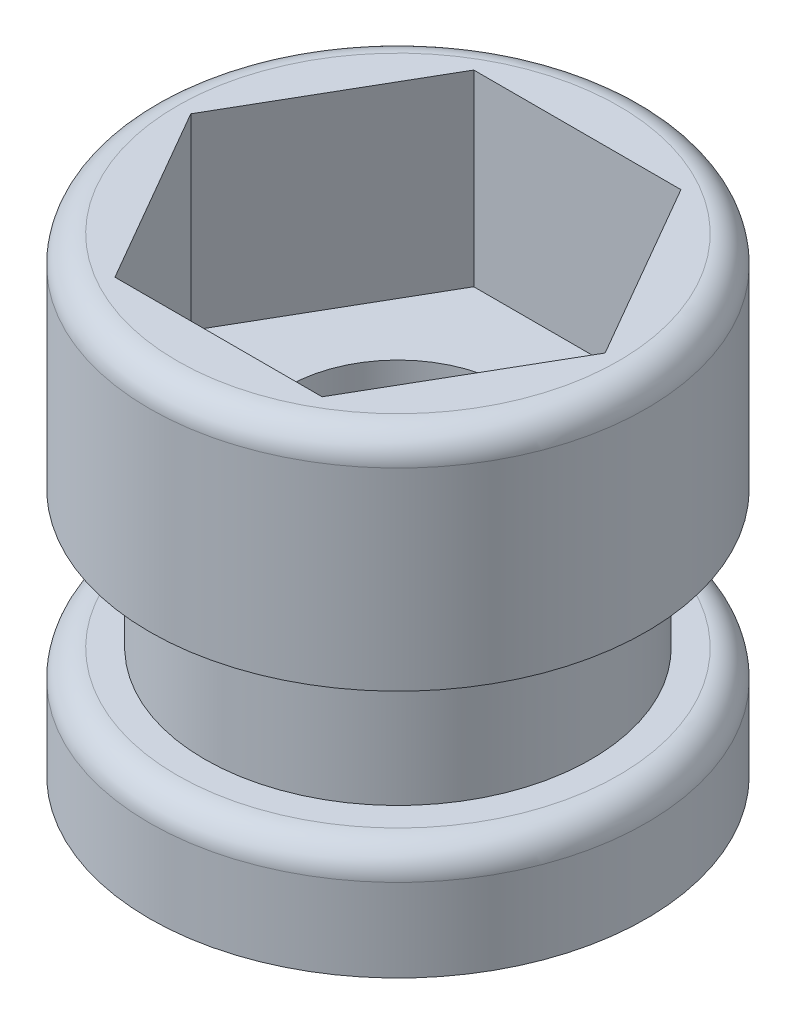
ISO-10303-21;
HEADER;
FILE_DESCRIPTION(('STEP AP214'),'2;1');
FILE_NAME('part.step','',(''),(''),'','','');
FILE_SCHEMA(('AUTOMOTIVE_DESIGN { 1 0 10303 214 1 1 1 1 }'));
ENDSEC;
DATA;
#1=APPLICATION_CONTEXT('core data for automotive mechanical design processes');
#2=APPLICATION_PROTOCOL_DEFINITION('international standard','automotive_design',2000,#1);
#3=PRODUCT_CONTEXT('',#1,'mechanical');
#4=PRODUCT('Part','Part','',(#3));
#5=PRODUCT_RELATED_PRODUCT_CATEGORY('part','',(#4));
#6=PRODUCT_DEFINITION_FORMATION('','',#4);
#7=PRODUCT_DEFINITION_CONTEXT('part definition',#1,'design');
#8=PRODUCT_DEFINITION('design','',#6,#7);
#9=PRODUCT_DEFINITION_SHAPE('','',#8);
#10=(LENGTH_UNIT() NAMED_UNIT(*) SI_UNIT(.MILLI.,.METRE.));
#11=(NAMED_UNIT(*) PLANE_ANGLE_UNIT() SI_UNIT($,.RADIAN.));
#12=(NAMED_UNIT(*) SI_UNIT($,.STERADIAN.) SOLID_ANGLE_UNIT());
#13=UNCERTAINTY_MEASURE_WITH_UNIT(LENGTH_MEASURE(1.E-05),#10,'distance_accuracy_value','');
#14=(GEOMETRIC_REPRESENTATION_CONTEXT(3) GLOBAL_UNCERTAINTY_ASSIGNED_CONTEXT((#13)) GLOBAL_UNIT_ASSIGNED_CONTEXT((#10,
#11,#12)) REPRESENTATION_CONTEXT('',''));
#15=CARTESIAN_POINT('',(0.,0.,0.));
#16=DIRECTION('',(0.,0.,1.));
#17=DIRECTION('',(1.,0.,0.));
#18=AXIS2_PLACEMENT_3D('',#15,#16,#17);
#19=CARTESIAN_POINT('',(0.,18.,0.));
#20=DIRECTION('',(0.,-1.,0.));
#21=DIRECTION('',(0.,0.,-1.));
#22=AXIS2_PLACEMENT_3D('',#19,#20,#21);
#23=CYLINDRICAL_SURFACE('',#22,4.);
#24=CARTESIAN_POINT('',(0.,0.,0.));
#25=DIRECTION('',(0.,-1.,0.));
#26=DIRECTION('',(0.,0.,-1.));
#27=AXIS2_PLACEMENT_3D('',#24,#25,#26);
#28=CIRCLE('',#27,4.);
#29=CARTESIAN_POINT('',(0.,0.,-4.));
#30=VERTEX_POINT('',#29);
#31=EDGE_CURVE('E141',#30,#30,#28,.T.);
#32=ORIENTED_EDGE('',*,*,#31,.T.);
#33=EDGE_LOOP('',(#32));
#34=FACE_BOUND('',#33,.T.);
#35=CARTESIAN_POINT('',(0.,10.2,0.));
#36=DIRECTION('',(0.,1.,0.));
#37=DIRECTION('',(0.,0.,1.));
#38=AXIS2_PLACEMENT_3D('',#35,#36,#37);
#39=CIRCLE('',#38,4.);
#40=CARTESIAN_POINT('',(0.,10.2,4.));
#41=VERTEX_POINT('',#40);
#42=EDGE_CURVE('E36',#41,#41,#39,.F.);
#43=ORIENTED_EDGE('',*,*,#42,.F.);
#44=EDGE_LOOP('',(#43));
#45=FACE_BOUND('',#44,.T.);
#46=ADVANCED_FACE('F32',(#34,#45),#23,.F.);
#47=CARTESIAN_POINT('',(0.,4.,0.));
#48=DIRECTION('',(0.,-1.,0.));
#49=DIRECTION('',(0.,0.,-1.));
#50=AXIS2_PLACEMENT_3D('',#47,#48,#49);
#51=CYLINDRICAL_SURFACE('',#50,9.);
#52=CARTESIAN_POINT('',(0.,3.,0.));
#53=DIRECTION('',(0.,1.,0.));
#54=DIRECTION('',(0.,0.,1.));
#55=AXIS2_PLACEMENT_3D('',#52,#53,#54);
#56=CIRCLE('',#55,9.);
#57=CARTESIAN_POINT('',(0.,3.,9.));
#58=VERTEX_POINT('',#57);
#59=EDGE_CURVE('E11',#58,#58,#56,.F.);
#60=ORIENTED_EDGE('',*,*,#59,.T.);
#61=EDGE_LOOP('',(#60));
#62=FACE_BOUND('',#61,.T.);
#63=CARTESIAN_POINT('',(0.,0.,0.));
#64=DIRECTION('',(0.,1.,0.));
#65=DIRECTION('',(0.,0.,1.));
#66=AXIS2_PLACEMENT_3D('',#63,#64,#65);
#67=CIRCLE('',#66,9.);
#68=CARTESIAN_POINT('',(0.,0.,9.));
#69=VERTEX_POINT('',#68);
#70=EDGE_CURVE('E151',#69,#69,#67,.T.);
#71=ORIENTED_EDGE('',*,*,#70,.T.);
#72=EDGE_LOOP('',(#71));
#73=FACE_BOUND('',#72,.T.);
#74=ADVANCED_FACE('F181',(#62,#73),#51,.T.);
#75=CARTESIAN_POINT('',(0.,4.,0.));
#76=DIRECTION('',(0.,1.,0.));
#77=DIRECTION('',(0.,0.,1.));
#78=AXIS2_PLACEMENT_3D('',#75,#76,#77);
#79=PLANE('',#78);
#80=CARTESIAN_POINT('',(0.,4.,0.));
#81=DIRECTION('',(0.,1.,0.));
#82=DIRECTION('',(0.,0.,1.));
#83=AXIS2_PLACEMENT_3D('',#80,#81,#82);
#84=CIRCLE('',#83,8.);
#85=CARTESIAN_POINT('',(0.,4.,8.));
#86=VERTEX_POINT('',#85);
#87=EDGE_CURVE('E41',#86,#86,#84,.T.);
#88=ORIENTED_EDGE('',*,*,#87,.T.);
#89=EDGE_LOOP('',(#88));
#90=FACE_BOUND('',#89,.T.);
#91=CARTESIAN_POINT('',(0.,4.,0.));
#92=DIRECTION('',(0.,1.,0.));
#93=DIRECTION('',(0.,0.,1.));
#94=AXIS2_PLACEMENT_3D('',#91,#92,#93);
#95=CIRCLE('',#94,7.);
#96=CARTESIAN_POINT('',(0.,4.,7.));
#97=VERTEX_POINT('',#96);
#98=EDGE_CURVE('E147',#97,#97,#95,.T.);
#99=ORIENTED_EDGE('',*,*,#98,.F.);
#100=EDGE_LOOP('',(#99));
#101=FACE_BOUND('',#100,.T.);
#102=ADVANCED_FACE('F165',(#90,#101),#79,.T.);
#103=CARTESIAN_POINT('',(0.,0.,0.));
#104=DIRECTION('',(0.,1.,0.));
#105=DIRECTION('',(0.,0.,1.));
#106=AXIS2_PLACEMENT_3D('',#103,#104,#105);
#107=PLANE('',#106);
#108=ORIENTED_EDGE('',*,*,#31,.F.);
#109=EDGE_LOOP('',(#108));
#110=FACE_BOUND('',#109,.T.);
#111=ORIENTED_EDGE('',*,*,#70,.F.);
#112=EDGE_LOOP('',(#111));
#113=FACE_BOUND('',#112,.T.);
#114=ADVANCED_FACE('F207',(#110,#113),#107,.F.);
#115=CARTESIAN_POINT('',(0.,9.,0.));
#116=DIRECTION('',(0.,-1.,0.));
#117=DIRECTION('',(0.,0.,-1.));
#118=AXIS2_PLACEMENT_3D('',#115,#116,#117);
#119=CYLINDRICAL_SURFACE('',#118,7.);
#120=CARTESIAN_POINT('',(0.,9.,0.));
#121=DIRECTION('',(0.,1.,0.));
#122=DIRECTION('',(0.,0.,1.));
#123=AXIS2_PLACEMENT_3D('',#120,#121,#122);
#124=CIRCLE('',#123,7.);
#125=CARTESIAN_POINT('',(0.,9.,7.));
#126=VERTEX_POINT('',#125);
#127=EDGE_CURVE('E148',#126,#126,#124,.T.);
#128=ORIENTED_EDGE('',*,*,#127,.F.);
#129=EDGE_LOOP('',(#128));
#130=FACE_BOUND('',#129,.T.);
#131=ORIENTED_EDGE('',*,*,#98,.T.);
#132=EDGE_LOOP('',(#131));
#133=FACE_BOUND('',#132,.T.);
#134=ADVANCED_FACE('F203',(#130,#133),#119,.T.);
#135=CARTESIAN_POINT('',(0.,17.,0.));
#136=DIRECTION('',(0.,-1.,0.));
#137=DIRECTION('',(0.,0.,-1.));
#138=AXIS2_PLACEMENT_3D('',#135,#136,#137);
#139=CYLINDRICAL_SURFACE('',#138,9.);
#140=CARTESIAN_POINT('',(0.,16.,0.));
#141=DIRECTION('',(0.,1.,0.));
#142=DIRECTION('',(0.,0.,1.));
#143=AXIS2_PLACEMENT_3D('',#140,#141,#142);
#144=CIRCLE('',#143,9.);
#145=CARTESIAN_POINT('',(0.,16.,9.));
#146=VERTEX_POINT('',#145);
#147=EDGE_CURVE('E159',#146,#146,#144,.F.);
#148=ORIENTED_EDGE('',*,*,#147,.T.);
#149=EDGE_LOOP('',(#148));
#150=FACE_BOUND('',#149,.T.);
#151=CARTESIAN_POINT('',(0.,9.,0.));
#152=DIRECTION('',(0.,1.,0.));
#153=DIRECTION('',(0.,0.,1.));
#154=AXIS2_PLACEMENT_3D('',#151,#152,#153);
#155=CIRCLE('',#154,9.);
#156=CARTESIAN_POINT('',(0.,9.,9.));
#157=VERTEX_POINT('',#156);
#158=EDGE_CURVE('E144',#157,#157,#155,.T.);
#159=ORIENTED_EDGE('',*,*,#158,.T.);
#160=EDGE_LOOP('',(#159));
#161=FACE_BOUND('',#160,.T.);
#162=ADVANCED_FACE('F196',(#150,#161),#139,.T.);
#163=CARTESIAN_POINT('',(0.,17.,0.));
#164=DIRECTION('',(0.,1.,0.));
#165=DIRECTION('',(0.,0.,1.));
#166=AXIS2_PLACEMENT_3D('',#163,#164,#165);
#167=PLANE('',#166);
#168=DIRECTION('',(-0.5,0.,0.866025403784439));
#169=VECTOR('',#168,1.);
#170=CARTESIAN_POINT('',(-3.75277674973257,17.,-6.5));
#171=LINE('',#170,#169);
#172=CARTESIAN_POINT('',(-3.75277674973257,17.,-6.5));
#173=VERTEX_POINT('',#172);
#174=CARTESIAN_POINT('',(-7.50555349946513,17.,0.));
#175=VERTEX_POINT('',#174);
#176=EDGE_CURVE('E48',#173,#175,#171,.T.);
#177=ORIENTED_EDGE('',*,*,#176,.F.);
#178=DIRECTION('',(-1.,0.,0.));
#179=VECTOR('',#178,1.);
#180=CARTESIAN_POINT('',(3.75277674973257,17.,-6.5));
#181=LINE('',#180,#179);
#182=CARTESIAN_POINT('',(3.75277674973257,17.,-6.5));
#183=VERTEX_POINT('',#182);
#184=EDGE_CURVE('E132',#183,#173,#181,.T.);
#185=ORIENTED_EDGE('',*,*,#184,.F.);
#186=DIRECTION('',(-0.5,0.,-0.866025403784439));
#187=VECTOR('',#186,1.);
#188=CARTESIAN_POINT('',(7.50555349946513,17.,0.));
#189=LINE('',#188,#187);
#190=CARTESIAN_POINT('',(7.50555349946513,17.,0.));
#191=VERTEX_POINT('',#190);
#192=EDGE_CURVE('E130',#191,#183,#189,.T.);
#193=ORIENTED_EDGE('',*,*,#192,.F.);
#194=DIRECTION('',(0.5,0.,-0.866025403784439));
#195=VECTOR('',#194,1.);
#196=CARTESIAN_POINT('',(3.75277674973257,17.,6.5));
#197=LINE('',#196,#195);
#198=CARTESIAN_POINT('',(3.75277674973257,17.,6.5));
#199=VERTEX_POINT('',#198);
#200=EDGE_CURVE('E96',#199,#191,#197,.T.);
#201=ORIENTED_EDGE('',*,*,#200,.F.);
#202=DIRECTION('',(1.,0.,0.));
#203=VECTOR('',#202,1.);
#204=CARTESIAN_POINT('',(-3.75277674973257,17.,6.5));
#205=LINE('',#204,#203);
#206=CARTESIAN_POINT('',(-3.75277674973257,17.,6.5));
#207=VERTEX_POINT('',#206);
#208=EDGE_CURVE('E126',#207,#199,#205,.T.);
#209=ORIENTED_EDGE('',*,*,#208,.F.);
#210=DIRECTION('',(0.5,0.,0.866025403784439));
#211=VECTOR('',#210,1.);
#212=CARTESIAN_POINT('',(-7.50555349946513,17.,0.));
#213=LINE('',#212,#211);
#214=EDGE_CURVE('E123',#175,#207,#213,.T.);
#215=ORIENTED_EDGE('',*,*,#214,.F.);
#216=EDGE_LOOP('',(#177,#185,#193,#201,#209,#215));
#217=FACE_BOUND('',#216,.T.);
#218=CARTESIAN_POINT('',(0.,17.,0.));
#219=DIRECTION('',(0.,1.,0.));
#220=DIRECTION('',(0.,0.,1.));
#221=AXIS2_PLACEMENT_3D('',#218,#219,#220);
#222=CIRCLE('',#221,8.);
#223=CARTESIAN_POINT('',(0.,17.,8.));
#224=VERTEX_POINT('',#223);
#225=EDGE_CURVE('E156',#224,#224,#222,.T.);
#226=ORIENTED_EDGE('',*,*,#225,.T.);
#227=EDGE_LOOP('',(#226));
#228=FACE_BOUND('',#227,.T.);
#229=ADVANCED_FACE('F193',(#217,#228),#167,.T.);
#230=CARTESIAN_POINT('',(0.,9.,0.));
#231=DIRECTION('',(0.,1.,0.));
#232=DIRECTION('',(0.,0.,1.));
#233=AXIS2_PLACEMENT_3D('',#230,#231,#232);
#234=PLANE('',#233);
#235=ORIENTED_EDGE('',*,*,#127,.T.);
#236=EDGE_LOOP('',(#235));
#237=FACE_BOUND('',#236,.T.);
#238=ORIENTED_EDGE('',*,*,#158,.F.);
#239=EDGE_LOOP('',(#238));
#240=FACE_BOUND('',#239,.T.);
#241=ADVANCED_FACE('F177',(#237,#240),#234,.F.);
#242=CARTESIAN_POINT('',(0.,16.,0.));
#243=DIRECTION('',(0.,1.,0.));
#244=DIRECTION('',(0.,0.,1.));
#245=AXIS2_PLACEMENT_3D('',#242,#243,#244);
#246=TOROIDAL_SURFACE('',#245,8.,1.);
#247=ORIENTED_EDGE('',*,*,#147,.F.);
#248=EDGE_LOOP('',(#247));
#249=FACE_BOUND('',#248,.T.);
#250=ORIENTED_EDGE('',*,*,#225,.F.);
#251=EDGE_LOOP('',(#250));
#252=FACE_BOUND('',#251,.T.);
#253=ADVANCED_FACE('F169',(#249,#252),#246,.T.);
#254=CARTESIAN_POINT('',(0.,3.,0.));
#255=DIRECTION('',(0.,1.,0.));
#256=DIRECTION('',(0.,0.,1.));
#257=AXIS2_PLACEMENT_3D('',#254,#255,#256);
#258=TOROIDAL_SURFACE('',#257,8.,1.);
#259=ORIENTED_EDGE('',*,*,#59,.F.);
#260=EDGE_LOOP('',(#259));
#261=FACE_BOUND('',#260,.T.);
#262=ORIENTED_EDGE('',*,*,#87,.F.);
#263=EDGE_LOOP('',(#262));
#264=FACE_BOUND('',#263,.T.);
#265=ADVANCED_FACE('F34',(#261,#264),#258,.T.);
#266=CARTESIAN_POINT('',(0.,10.2,0.));
#267=DIRECTION('',(0.,1.,0.));
#268=DIRECTION('',(0.,0.,1.));
#269=AXIS2_PLACEMENT_3D('',#266,#267,#268);
#270=PLANE('',#269);
#271=DIRECTION('',(-0.5,0.,0.866025403784439));
#272=VECTOR('',#271,1.);
#273=CARTESIAN_POINT('',(-3.75277674973257,10.2,-6.5));
#274=LINE('',#273,#272);
#275=CARTESIAN_POINT('',(-3.75277674973257,10.2,-6.5));
#276=VERTEX_POINT('',#275);
#277=CARTESIAN_POINT('',(-7.50555349946513,10.2,0.));
#278=VERTEX_POINT('',#277);
#279=EDGE_CURVE('E134',#276,#278,#274,.T.);
#280=ORIENTED_EDGE('',*,*,#279,.T.);
#281=DIRECTION('',(0.5,0.,0.866025403784439));
#282=VECTOR('',#281,1.);
#283=CARTESIAN_POINT('',(-7.50555349946513,10.2,0.));
#284=LINE('',#283,#282);
#285=CARTESIAN_POINT('',(-3.75277674973257,10.2,6.5));
#286=VERTEX_POINT('',#285);
#287=EDGE_CURVE('E117',#278,#286,#284,.T.);
#288=ORIENTED_EDGE('',*,*,#287,.T.);
#289=DIRECTION('',(1.,0.,0.));
#290=VECTOR('',#289,1.);
#291=CARTESIAN_POINT('',(-3.75277674973257,10.2,6.5));
#292=LINE('',#291,#290);
#293=CARTESIAN_POINT('',(3.75277674973257,10.2,6.5));
#294=VERTEX_POINT('',#293);
#295=EDGE_CURVE('E115',#286,#294,#292,.T.);
#296=ORIENTED_EDGE('',*,*,#295,.T.);
#297=DIRECTION('',(0.5,0.,-0.866025403784439));
#298=VECTOR('',#297,1.);
#299=CARTESIAN_POINT('',(3.75277674973257,10.2,6.5));
#300=LINE('',#299,#298);
#301=CARTESIAN_POINT('',(7.50555349946513,10.2,0.));
#302=VERTEX_POINT('',#301);
#303=EDGE_CURVE('E93',#294,#302,#300,.T.);
#304=ORIENTED_EDGE('',*,*,#303,.T.);
#305=DIRECTION('',(-0.5,0.,-0.866025403784439));
#306=VECTOR('',#305,1.);
#307=CARTESIAN_POINT('',(7.50555349946513,10.2,0.));
#308=LINE('',#307,#306);
#309=CARTESIAN_POINT('',(3.75277674973257,10.2,-6.5));
#310=VERTEX_POINT('',#309);
#311=EDGE_CURVE('E104',#302,#310,#308,.T.);
#312=ORIENTED_EDGE('',*,*,#311,.T.);
#313=DIRECTION('',(-1.,0.,0.));
#314=VECTOR('',#313,1.);
#315=CARTESIAN_POINT('',(3.75277674973257,10.2,-6.5));
#316=LINE('',#315,#314);
#317=EDGE_CURVE('E108',#310,#276,#316,.T.);
#318=ORIENTED_EDGE('',*,*,#317,.T.);
#319=EDGE_LOOP('',(#280,#288,#296,#304,#312,#318));
#320=FACE_BOUND('',#319,.T.);
#321=ORIENTED_EDGE('',*,*,#42,.T.);
#322=EDGE_LOOP('',(#321));
#323=FACE_BOUND('',#322,.T.);
#324=ADVANCED_FACE('F111',(#320,#323),#270,.T.);
#325=CARTESIAN_POINT('',(-3.75277674973257,10.2,-6.5));
#326=DIRECTION('',(-0.866025403784439,0.,-0.5));
#327=DIRECTION('',(-0.5,0.,0.866025403784439));
#328=AXIS2_PLACEMENT_3D('',#325,#326,#327);
#329=PLANE('',#328);
#330=ORIENTED_EDGE('',*,*,#176,.T.);
#331=DIRECTION('',(0.,1.,0.));
#332=VECTOR('',#331,1.);
#333=CARTESIAN_POINT('',(-7.50555349946513,10.2,0.));
#334=LINE('',#333,#332);
#335=EDGE_CURVE('E78',#278,#175,#334,.T.);
#336=ORIENTED_EDGE('',*,*,#335,.F.);
#337=ORIENTED_EDGE('',*,*,#279,.F.);
#338=DIRECTION('',(0.,1.,0.));
#339=VECTOR('',#338,1.);
#340=CARTESIAN_POINT('',(-3.75277674973257,10.2,-6.5));
#341=LINE('',#340,#339);
#342=EDGE_CURVE('E56',#276,#173,#341,.T.);
#343=ORIENTED_EDGE('',*,*,#342,.T.);
#344=EDGE_LOOP('',(#330,#336,#337,#343));
#345=FACE_BOUND('',#344,.T.);
#346=ADVANCED_FACE('F175',(#345),#329,.F.);
#347=CARTESIAN_POINT('',(3.75277674973257,10.2,-6.5));
#348=DIRECTION('',(0.,0.,-1.));
#349=DIRECTION('',(-1.,0.,0.));
#350=AXIS2_PLACEMENT_3D('',#347,#348,#349);
#351=PLANE('',#350);
#352=ORIENTED_EDGE('',*,*,#184,.T.);
#353=ORIENTED_EDGE('',*,*,#342,.F.);
#354=ORIENTED_EDGE('',*,*,#317,.F.);
#355=DIRECTION('',(0.,1.,0.));
#356=VECTOR('',#355,1.);
#357=CARTESIAN_POINT('',(3.75277674973257,10.2,-6.5));
#358=LINE('',#357,#356);
#359=EDGE_CURVE('E100',#310,#183,#358,.T.);
#360=ORIENTED_EDGE('',*,*,#359,.T.);
#361=EDGE_LOOP('',(#352,#353,#354,#360));
#362=FACE_BOUND('',#361,.T.);
#363=ADVANCED_FACE('F274',(#362),#351,.F.);
#364=CARTESIAN_POINT('',(7.50555349946513,10.2,0.));
#365=DIRECTION('',(0.866025403784439,0.,-0.5));
#366=DIRECTION('',(-0.5,0.,-0.866025403784439));
#367=AXIS2_PLACEMENT_3D('',#364,#365,#366);
#368=PLANE('',#367);
#369=ORIENTED_EDGE('',*,*,#192,.T.);
#370=ORIENTED_EDGE('',*,*,#359,.F.);
#371=ORIENTED_EDGE('',*,*,#311,.F.);
#372=DIRECTION('',(0.,1.,0.));
#373=VECTOR('',#372,1.);
#374=CARTESIAN_POINT('',(7.50555349946513,10.2,0.));
#375=LINE('',#374,#373);
#376=EDGE_CURVE('E89',#302,#191,#375,.T.);
#377=ORIENTED_EDGE('',*,*,#376,.T.);
#378=EDGE_LOOP('',(#369,#370,#371,#377));
#379=FACE_BOUND('',#378,.T.);
#380=ADVANCED_FACE('F105',(#379),#368,.F.);
#381=CARTESIAN_POINT('',(3.75277674973257,10.2,6.5));
#382=DIRECTION('',(0.866025403784439,0.,0.5));
#383=DIRECTION('',(0.5,0.,-0.866025403784439));
#384=AXIS2_PLACEMENT_3D('',#381,#382,#383);
#385=PLANE('',#384);
#386=ORIENTED_EDGE('',*,*,#200,.T.);
#387=ORIENTED_EDGE('',*,*,#376,.F.);
#388=ORIENTED_EDGE('',*,*,#303,.F.);
#389=DIRECTION('',(0.,1.,0.));
#390=VECTOR('',#389,1.);
#391=CARTESIAN_POINT('',(3.75277674973257,10.2,6.5));
#392=LINE('',#391,#390);
#393=EDGE_CURVE('E101',#294,#199,#392,.T.);
#394=ORIENTED_EDGE('',*,*,#393,.T.);
#395=EDGE_LOOP('',(#386,#387,#388,#394));
#396=FACE_BOUND('',#395,.T.);
#397=ADVANCED_FACE('F91',(#396),#385,.F.);
#398=CARTESIAN_POINT('',(-3.75277674973257,10.2,6.5));
#399=DIRECTION('',(0.,0.,1.));
#400=DIRECTION('',(1.,0.,0.));
#401=AXIS2_PLACEMENT_3D('',#398,#399,#400);
#402=PLANE('',#401);
#403=ORIENTED_EDGE('',*,*,#208,.T.);
#404=ORIENTED_EDGE('',*,*,#393,.F.);
#405=ORIENTED_EDGE('',*,*,#295,.F.);
#406=DIRECTION('',(0.,1.,0.));
#407=VECTOR('',#406,1.);
#408=CARTESIAN_POINT('',(-3.75277674973257,10.2,6.5));
#409=LINE('',#408,#407);
#410=EDGE_CURVE('E138',#286,#207,#409,.T.);
#411=ORIENTED_EDGE('',*,*,#410,.T.);
#412=EDGE_LOOP('',(#403,#404,#405,#411));
#413=FACE_BOUND('',#412,.T.);
#414=ADVANCED_FACE('F295',(#413),#402,.F.);
#415=CARTESIAN_POINT('',(-7.50555349946513,10.2,0.));
#416=DIRECTION('',(-0.866025403784439,0.,0.5));
#417=DIRECTION('',(0.5,0.,0.866025403784439));
#418=AXIS2_PLACEMENT_3D('',#415,#416,#417);
#419=PLANE('',#418);
#420=ORIENTED_EDGE('',*,*,#214,.T.);
#421=ORIENTED_EDGE('',*,*,#410,.F.);
#422=ORIENTED_EDGE('',*,*,#287,.F.);
#423=ORIENTED_EDGE('',*,*,#335,.T.);
#424=EDGE_LOOP('',(#420,#421,#422,#423));
#425=FACE_BOUND('',#424,.T.);
#426=ADVANCED_FACE('F303',(#425),#419,.F.);
#427=CLOSED_SHELL('',(#46,#74,#102,#114,#134,#162,#229,#241,#253,#265,#324,#346,#363,#380,#397,
#414,#426));
#428=MANIFOLD_SOLID_BREP('B2',#427);
#429=ADVANCED_BREP_SHAPE_REPRESENTATION('',(#18,#428),#14);
#430=SHAPE_DEFINITION_REPRESENTATION(#9,#429);
ENDSEC;
END-ISO-10303-21;
